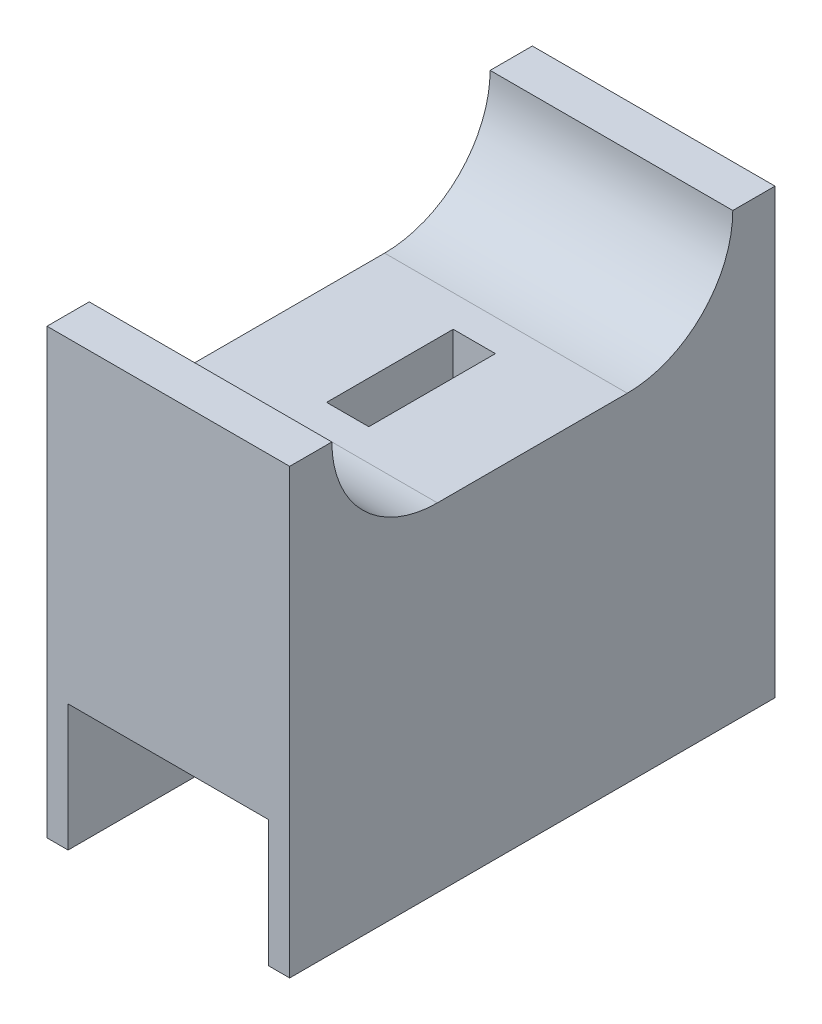
ISO-10303-21;
HEADER;
FILE_DESCRIPTION(('STEP AP214'),'2;1');
FILE_NAME('part.step','',(''),(''),'','','');
FILE_SCHEMA(('AUTOMOTIVE_DESIGN { 1 0 10303 214 1 1 1 1 }'));
ENDSEC;
DATA;
#1=APPLICATION_CONTEXT('core data for automotive mechanical design processes');
#2=APPLICATION_PROTOCOL_DEFINITION('international standard','automotive_design',2000,#1);
#3=PRODUCT_CONTEXT('',#1,'mechanical');
#4=PRODUCT('Part','Part','',(#3));
#5=PRODUCT_RELATED_PRODUCT_CATEGORY('part','',(#4));
#6=PRODUCT_DEFINITION_FORMATION('','',#4);
#7=PRODUCT_DEFINITION_CONTEXT('part definition',#1,'design');
#8=PRODUCT_DEFINITION('design','',#6,#7);
#9=PRODUCT_DEFINITION_SHAPE('','',#8);
#10=(LENGTH_UNIT() NAMED_UNIT(*) SI_UNIT(.MILLI.,.METRE.));
#11=(NAMED_UNIT(*) PLANE_ANGLE_UNIT() SI_UNIT($,.RADIAN.));
#12=(NAMED_UNIT(*) SI_UNIT($,.STERADIAN.) SOLID_ANGLE_UNIT());
#13=UNCERTAINTY_MEASURE_WITH_UNIT(LENGTH_MEASURE(1.E-05),#10,'distance_accuracy_value','');
#14=(GEOMETRIC_REPRESENTATION_CONTEXT(3) GLOBAL_UNCERTAINTY_ASSIGNED_CONTEXT((#13)) GLOBAL_UNIT_ASSIGNED_CONTEXT((#10,
#11,#12)) REPRESENTATION_CONTEXT('',''));
#15=CARTESIAN_POINT('',(0.,0.,0.));
#16=DIRECTION('',(0.,0.,1.));
#17=DIRECTION('',(1.,0.,0.));
#18=AXIS2_PLACEMENT_3D('',#15,#16,#17);
#19=CARTESIAN_POINT('',(0.,15.,0.));
#20=DIRECTION('',(0.,-1.,0.));
#21=DIRECTION('',(0.,0.,-1.));
#22=AXIS2_PLACEMENT_3D('',#19,#20,#21);
#23=PLANE('',#22);
#24=DIRECTION('',(0.,0.,1.));
#25=VECTOR('',#24,1.);
#26=CARTESIAN_POINT('',(-5.75000000000006,15.,11.5000000000001));
#27=LINE('',#26,#25);
#28=CARTESIAN_POINT('',(-5.75000000000006,15.,-11.5000000000001));
#29=VERTEX_POINT('',#28);
#30=CARTESIAN_POINT('',(-5.74999999999994,15.,-9.50000000000007));
#31=VERTEX_POINT('',#30);
#32=EDGE_CURVE('E192',#29,#31,#27,.T.);
#33=ORIENTED_EDGE('',*,*,#32,.T.);
#34=DIRECTION('',(-1.,0.,0.));
#35=VECTOR('',#34,1.);
#36=CARTESIAN_POINT('',(5.75000000000006,15.,-9.50000000000007));
#37=LINE('',#36,#35);
#38=CARTESIAN_POINT('',(5.75000000000006,15.,-9.50000000000007));
#39=VERTEX_POINT('',#38);
#40=EDGE_CURVE('E178',#39,#31,#37,.T.);
#41=ORIENTED_EDGE('',*,*,#40,.F.);
#42=DIRECTION('',(0.,0.,-1.));
#43=VECTOR('',#42,1.);
#44=CARTESIAN_POINT('',(5.75000000000006,15.,11.5000000000001));
#45=LINE('',#44,#43);
#46=CARTESIAN_POINT('',(5.75000000000006,15.,-11.5000000000001));
#47=VERTEX_POINT('',#46);
#48=EDGE_CURVE('E175',#39,#47,#45,.T.);
#49=ORIENTED_EDGE('',*,*,#48,.T.);
#50=DIRECTION('',(-1.,0.,0.));
#51=VECTOR('',#50,1.);
#52=CARTESIAN_POINT('',(-5.75000000000006,15.,-11.5000000000001));
#53=LINE('',#52,#51);
#54=EDGE_CURVE('E174',#47,#29,#53,.T.);
#55=ORIENTED_EDGE('',*,*,#54,.T.);
#56=EDGE_LOOP('',(#33,#41,#49,#55));
#57=FACE_BOUND('',#56,.T.);
#58=ADVANCED_FACE('F45',(#57),#23,.F.);
#59=CARTESIAN_POINT('',(0.,-6.,0.));
#60=DIRECTION('',(0.,1.,0.));
#61=DIRECTION('',(0.,0.,1.));
#62=AXIS2_PLACEMENT_3D('',#59,#60,#61);
#63=PLANE('',#62);
#64=DIRECTION('',(1.,0.,0.));
#65=VECTOR('',#64,1.);
#66=CARTESIAN_POINT('',(-5.75000000000006,-6.,-11.5000000000001));
#67=LINE('',#66,#65);
#68=CARTESIAN_POINT('',(-5.75000000000006,-6.,-11.5000000000001));
#69=VERTEX_POINT('',#68);
#70=CARTESIAN_POINT('',(-4.75,-6.,-11.5000000000001));
#71=VERTEX_POINT('',#70);
#72=EDGE_CURVE('E288',#69,#71,#67,.T.);
#73=ORIENTED_EDGE('',*,*,#72,.T.);
#74=DIRECTION('',(0.,0.,1.));
#75=VECTOR('',#74,1.);
#76=CARTESIAN_POINT('',(-4.75,-6.,-11.5000000000001));
#77=LINE('',#76,#75);
#78=CARTESIAN_POINT('',(-4.75,-6.,11.5000000000001));
#79=VERTEX_POINT('',#78);
#80=EDGE_CURVE('E252',#71,#79,#77,.T.);
#81=ORIENTED_EDGE('',*,*,#80,.T.);
#82=DIRECTION('',(-1.,0.,0.));
#83=VECTOR('',#82,1.);
#84=CARTESIAN_POINT('',(-5.75000000000006,-6.,11.5000000000001));
#85=LINE('',#84,#83);
#86=CARTESIAN_POINT('',(-5.75000000000006,-6.,11.5000000000001));
#87=VERTEX_POINT('',#86);
#88=EDGE_CURVE('E278',#79,#87,#85,.T.);
#89=ORIENTED_EDGE('',*,*,#88,.T.);
#90=DIRECTION('',(0.,0.,-1.));
#91=VECTOR('',#90,1.);
#92=CARTESIAN_POINT('',(-5.75000000000006,-6.,-11.5000000000001));
#93=LINE('',#92,#91);
#94=EDGE_CURVE('E283',#87,#69,#93,.T.);
#95=ORIENTED_EDGE('',*,*,#94,.T.);
#96=EDGE_LOOP('',(#73,#81,#89,#95));
#97=FACE_BOUND('',#96,.T.);
#98=ADVANCED_FACE('F337',(#97),#63,.F.);
#99=CARTESIAN_POINT('',(5.75000000000006,11.,11.5000000000001));
#100=DIRECTION('',(-1.,0.,0.));
#101=DIRECTION('',(0.,0.,1.));
#102=AXIS2_PLACEMENT_3D('',#99,#100,#101);
#103=PLANE('',#102);
#104=ORIENTED_EDGE('',*,*,#48,.F.);
#105=CARTESIAN_POINT('',(5.75000000000006,15.,-4.50000000000007));
#106=DIRECTION('',(-1.,0.,0.));
#107=DIRECTION('',(0.,0.,1.));
#108=AXIS2_PLACEMENT_3D('',#105,#106,#107);
#109=CIRCLE('',#108,5.);
#110=CARTESIAN_POINT('',(5.75000000000006,10.,-4.50000000000007));
#111=VERTEX_POINT('',#110);
#112=EDGE_CURVE('E68',#39,#111,#109,.T.);
#113=ORIENTED_EDGE('',*,*,#112,.T.);
#114=DIRECTION('',(0.,0.,1.));
#115=VECTOR('',#114,1.);
#116=CARTESIAN_POINT('',(5.75000000000006,10.,-9.50000000000007));
#117=LINE('',#116,#115);
#118=CARTESIAN_POINT('',(5.75000000000006,10.,4.50000000000006));
#119=VERTEX_POINT('',#118);
#120=EDGE_CURVE('E162',#111,#119,#117,.T.);
#121=ORIENTED_EDGE('',*,*,#120,.T.);
#122=CARTESIAN_POINT('',(5.75000000000006,15.,4.50000000000007));
#123=DIRECTION('',(-1.,0.,0.));
#124=DIRECTION('',(0.,0.,1.));
#125=AXIS2_PLACEMENT_3D('',#122,#123,#124);
#126=CIRCLE('',#125,5.);
#127=CARTESIAN_POINT('',(5.75000000000006,15.,9.50000000000007));
#128=VERTEX_POINT('',#127);
#129=EDGE_CURVE('E11',#119,#128,#126,.T.);
#130=ORIENTED_EDGE('',*,*,#129,.T.);
#131=CARTESIAN_POINT('',(5.75000000000006,15.,11.5000000000001));
#132=VERTEX_POINT('',#131);
#133=EDGE_CURVE('E161',#132,#128,#45,.T.);
#134=ORIENTED_EDGE('',*,*,#133,.F.);
#135=DIRECTION('',(0.,-1.,0.));
#136=VECTOR('',#135,1.);
#137=CARTESIAN_POINT('',(5.75000000000006,11.,11.5000000000001));
#138=LINE('',#137,#136);
#139=CARTESIAN_POINT('',(5.75000000000006,-6.,11.5000000000001));
#140=VERTEX_POINT('',#139);
#141=EDGE_CURVE('E292',#132,#140,#138,.T.);
#142=ORIENTED_EDGE('',*,*,#141,.T.);
#143=DIRECTION('',(0.,0.,1.));
#144=VECTOR('',#143,1.);
#145=CARTESIAN_POINT('',(5.75000000000006,-6.,-11.5000000000001));
#146=LINE('',#145,#144);
#147=CARTESIAN_POINT('',(5.75000000000006,-6.,-11.5000000000001));
#148=VERTEX_POINT('',#147);
#149=EDGE_CURVE('E265',#148,#140,#146,.T.);
#150=ORIENTED_EDGE('',*,*,#149,.F.);
#151=DIRECTION('',(0.,-1.,0.));
#152=VECTOR('',#151,1.);
#153=CARTESIAN_POINT('',(5.75000000000006,11.,-11.5000000000001));
#154=LINE('',#153,#152);
#155=EDGE_CURVE('E302',#47,#148,#154,.T.);
#156=ORIENTED_EDGE('',*,*,#155,.F.);
#157=EDGE_LOOP('',(#104,#113,#121,#130,#134,#142,#150,#156));
#158=FACE_BOUND('',#157,.T.);
#159=ADVANCED_FACE('F160',(#158),#103,.F.);
#160=CARTESIAN_POINT('',(-5.74999999999994,11.,-11.5000000000001));
#161=DIRECTION('',(0.,0.,1.));
#162=DIRECTION('',(1.,0.,0.));
#163=AXIS2_PLACEMENT_3D('',#160,#161,#162);
#164=PLANE('',#163);
#165=DIRECTION('',(-1.,0.,0.));
#166=VECTOR('',#165,1.);
#167=CARTESIAN_POINT('',(-4.75,0.,-11.5000000000001));
#168=LINE('',#167,#166);
#169=CARTESIAN_POINT('',(4.75,0.,-11.5000000000001));
#170=VERTEX_POINT('',#169);
#171=CARTESIAN_POINT('',(-4.75,0.,-11.5000000000001));
#172=VERTEX_POINT('',#171);
#173=EDGE_CURVE('E248',#170,#172,#168,.T.);
#174=ORIENTED_EDGE('',*,*,#173,.T.);
#175=DIRECTION('',(0.,-1.,0.));
#176=VECTOR('',#175,1.);
#177=CARTESIAN_POINT('',(-4.75,-6.,-11.5000000000001));
#178=LINE('',#177,#176);
#179=EDGE_CURVE('E239',#172,#71,#178,.T.);
#180=ORIENTED_EDGE('',*,*,#179,.T.);
#181=ORIENTED_EDGE('',*,*,#72,.F.);
#182=DIRECTION('',(0.,-1.,0.));
#183=VECTOR('',#182,1.);
#184=CARTESIAN_POINT('',(-5.74999999999994,11.,-11.5000000000001));
#185=LINE('',#184,#183);
#186=EDGE_CURVE('E299',#29,#69,#185,.T.);
#187=ORIENTED_EDGE('',*,*,#186,.F.);
#188=ORIENTED_EDGE('',*,*,#54,.F.);
#189=ORIENTED_EDGE('',*,*,#155,.T.);
#190=CARTESIAN_POINT('',(4.75,-6.,-11.5000000000001));
#191=VERTEX_POINT('',#190);
#192=EDGE_CURVE('E287',#191,#148,#67,.T.);
#193=ORIENTED_EDGE('',*,*,#192,.F.);
#194=DIRECTION('',(0.,1.,0.));
#195=VECTOR('',#194,1.);
#196=CARTESIAN_POINT('',(4.75,-6.,-11.5000000000001));
#197=LINE('',#196,#195);
#198=EDGE_CURVE('E243',#191,#170,#197,.T.);
#199=ORIENTED_EDGE('',*,*,#198,.T.);
#200=EDGE_LOOP('',(#174,#180,#181,#187,#188,#189,#193,#199));
#201=FACE_BOUND('',#200,.T.);
#202=ADVANCED_FACE('F331',(#201),#164,.F.);
#203=CARTESIAN_POINT('',(-5.74999999999994,11.,11.5000000000001));
#204=DIRECTION('',(1.,0.,0.));
#205=DIRECTION('',(0.,0.,-1.));
#206=AXIS2_PLACEMENT_3D('',#203,#204,#205);
#207=PLANE('',#206);
#208=DIRECTION('',(0.,0.,1.));
#209=VECTOR('',#208,1.);
#210=CARTESIAN_POINT('',(-5.74999999999994,10.,-9.50000000000007));
#211=LINE('',#210,#209);
#212=CARTESIAN_POINT('',(-5.74999999999994,10.,-4.50000000000007));
#213=VERTEX_POINT('',#212);
#214=CARTESIAN_POINT('',(-5.74999999999994,10.,4.50000000000006));
#215=VERTEX_POINT('',#214);
#216=EDGE_CURVE('E184',#213,#215,#211,.T.);
#217=ORIENTED_EDGE('',*,*,#216,.F.);
#218=CARTESIAN_POINT('',(-5.74999999999994,15.,-4.50000000000007));
#219=DIRECTION('',(1.,0.,0.));
#220=DIRECTION('',(0.,0.,-1.));
#221=AXIS2_PLACEMENT_3D('',#218,#219,#220);
#222=CIRCLE('',#221,5.);
#223=EDGE_CURVE('E312',#213,#31,#222,.T.);
#224=ORIENTED_EDGE('',*,*,#223,.T.);
#225=ORIENTED_EDGE('',*,*,#32,.F.);
#226=ORIENTED_EDGE('',*,*,#186,.T.);
#227=ORIENTED_EDGE('',*,*,#94,.F.);
#228=DIRECTION('',(0.,-1.,0.));
#229=VECTOR('',#228,1.);
#230=CARTESIAN_POINT('',(-5.74999999999994,11.,11.5000000000001));
#231=LINE('',#230,#229);
#232=CARTESIAN_POINT('',(-5.75000000000006,15.,11.5000000000001));
#233=VERTEX_POINT('',#232);
#234=EDGE_CURVE('E295',#233,#87,#231,.T.);
#235=ORIENTED_EDGE('',*,*,#234,.F.);
#236=CARTESIAN_POINT('',(-5.75000000000006,15.,9.50000000000007));
#237=VERTEX_POINT('',#236);
#238=EDGE_CURVE('E191',#237,#233,#27,.T.);
#239=ORIENTED_EDGE('',*,*,#238,.F.);
#240=CARTESIAN_POINT('',(-5.74999999999994,15.,4.50000000000007));
#241=DIRECTION('',(1.,0.,0.));
#242=DIRECTION('',(0.,0.,-1.));
#243=AXIS2_PLACEMENT_3D('',#240,#241,#242);
#244=CIRCLE('',#243,5.);
#245=EDGE_CURVE('E54',#237,#215,#244,.T.);
#246=ORIENTED_EDGE('',*,*,#245,.T.);
#247=EDGE_LOOP('',(#217,#224,#225,#226,#227,#235,#239,#246));
#248=FACE_BOUND('',#247,.T.);
#249=ADVANCED_FACE('F319',(#248),#207,.F.);
#250=CARTESIAN_POINT('',(-5.74999999999994,11.,11.5000000000001));
#251=DIRECTION('',(0.,0.,-1.));
#252=DIRECTION('',(-1.,0.,0.));
#253=AXIS2_PLACEMENT_3D('',#250,#251,#252);
#254=PLANE('',#253);
#255=ORIENTED_EDGE('',*,*,#88,.F.);
#256=DIRECTION('',(0.,-1.,0.));
#257=VECTOR('',#256,1.);
#258=CARTESIAN_POINT('',(-4.75,-6.,11.5000000000001));
#259=LINE('',#258,#257);
#260=CARTESIAN_POINT('',(-4.75,0.,11.5000000000001));
#261=VERTEX_POINT('',#260);
#262=EDGE_CURVE('E229',#261,#79,#259,.T.);
#263=ORIENTED_EDGE('',*,*,#262,.F.);
#264=DIRECTION('',(-1.,0.,0.));
#265=VECTOR('',#264,1.);
#266=CARTESIAN_POINT('',(-4.75,0.,11.5000000000001));
#267=LINE('',#266,#265);
#268=CARTESIAN_POINT('',(4.75,0.,11.5000000000001));
#269=VERTEX_POINT('',#268);
#270=EDGE_CURVE('E244',#269,#261,#267,.T.);
#271=ORIENTED_EDGE('',*,*,#270,.F.);
#272=DIRECTION('',(0.,1.,0.));
#273=VECTOR('',#272,1.);
#274=CARTESIAN_POINT('',(4.75,-6.,11.5000000000001));
#275=LINE('',#274,#273);
#276=CARTESIAN_POINT('',(4.75,-6.,11.5000000000001));
#277=VERTEX_POINT('',#276);
#278=EDGE_CURVE('E255',#277,#269,#275,.T.);
#279=ORIENTED_EDGE('',*,*,#278,.F.);
#280=EDGE_CURVE('E279',#140,#277,#85,.T.);
#281=ORIENTED_EDGE('',*,*,#280,.F.);
#282=ORIENTED_EDGE('',*,*,#141,.F.);
#283=DIRECTION('',(1.,0.,0.));
#284=VECTOR('',#283,1.);
#285=CARTESIAN_POINT('',(-5.75000000000006,15.,11.5000000000001));
#286=LINE('',#285,#284);
#287=EDGE_CURVE('E172',#233,#132,#286,.T.);
#288=ORIENTED_EDGE('',*,*,#287,.F.);
#289=ORIENTED_EDGE('',*,*,#234,.T.);
#290=EDGE_LOOP('',(#255,#263,#271,#279,#281,#282,#288,#289));
#291=FACE_BOUND('',#290,.T.);
#292=ADVANCED_FACE('F342',(#291),#254,.F.);
#293=ORIENTED_EDGE('',*,*,#280,.T.);
#294=DIRECTION('',(0.,0.,1.));
#295=VECTOR('',#294,1.);
#296=CARTESIAN_POINT('',(4.75,-6.,-11.5000000000001));
#297=LINE('',#296,#295);
#298=EDGE_CURVE('E269',#191,#277,#297,.T.);
#299=ORIENTED_EDGE('',*,*,#298,.F.);
#300=ORIENTED_EDGE('',*,*,#192,.T.);
#301=ORIENTED_EDGE('',*,*,#149,.T.);
#302=EDGE_LOOP('',(#293,#299,#300,#301));
#303=FACE_BOUND('',#302,.T.);
#304=ADVANCED_FACE('F346',(#303),#63,.F.);
#305=CARTESIAN_POINT('',(-4.75,-6.,-11.5000000000001));
#306=DIRECTION('',(-1.,0.,0.));
#307=DIRECTION('',(0.,-1.,0.));
#308=AXIS2_PLACEMENT_3D('',#305,#306,#307);
#309=PLANE('',#308);
#310=ORIENTED_EDGE('',*,*,#262,.T.);
#311=ORIENTED_EDGE('',*,*,#80,.F.);
#312=ORIENTED_EDGE('',*,*,#179,.F.);
#313=DIRECTION('',(0.,0.,1.));
#314=VECTOR('',#313,1.);
#315=CARTESIAN_POINT('',(-4.75,0.,-11.5000000000001));
#316=LINE('',#315,#314);
#317=EDGE_CURVE('E262',#172,#261,#316,.T.);
#318=ORIENTED_EDGE('',*,*,#317,.T.);
#319=EDGE_LOOP('',(#310,#311,#312,#318));
#320=FACE_BOUND('',#319,.T.);
#321=ADVANCED_FACE('F359',(#320),#309,.F.);
#322=CARTESIAN_POINT('',(-4.75,0.,-11.5000000000001));
#323=DIRECTION('',(0.,1.,0.));
#324=DIRECTION('',(0.,0.,1.));
#325=AXIS2_PLACEMENT_3D('',#322,#323,#324);
#326=PLANE('',#325);
#327=DIRECTION('',(-1.,0.,0.));
#328=VECTOR('',#327,1.);
#329=CARTESIAN_POINT('',(-1.,0.,3.));
#330=LINE('',#329,#328);
#331=CARTESIAN_POINT('',(1.,0.,3.));
#332=VERTEX_POINT('',#331);
#333=CARTESIAN_POINT('',(-1.,0.,3.));
#334=VERTEX_POINT('',#333);
#335=EDGE_CURVE('E215',#332,#334,#330,.T.);
#336=ORIENTED_EDGE('',*,*,#335,.F.);
#337=DIRECTION('',(0.,0.,1.));
#338=VECTOR('',#337,1.);
#339=CARTESIAN_POINT('',(1.,0.,-3.));
#340=LINE('',#339,#338);
#341=CARTESIAN_POINT('',(1.,0.,-3.));
#342=VERTEX_POINT('',#341);
#343=EDGE_CURVE('E198',#342,#332,#340,.T.);
#344=ORIENTED_EDGE('',*,*,#343,.F.);
#345=DIRECTION('',(1.,0.,0.));
#346=VECTOR('',#345,1.);
#347=CARTESIAN_POINT('',(-1.,0.,-3.));
#348=LINE('',#347,#346);
#349=CARTESIAN_POINT('',(-1.,0.,-3.));
#350=VERTEX_POINT('',#349);
#351=EDGE_CURVE('E203',#350,#342,#348,.T.);
#352=ORIENTED_EDGE('',*,*,#351,.F.);
#353=DIRECTION('',(0.,0.,-1.));
#354=VECTOR('',#353,1.);
#355=CARTESIAN_POINT('',(-1.,0.,-3.));
#356=LINE('',#355,#354);
#357=EDGE_CURVE('E219',#334,#350,#356,.T.);
#358=ORIENTED_EDGE('',*,*,#357,.F.);
#359=EDGE_LOOP('',(#336,#344,#352,#358));
#360=FACE_BOUND('',#359,.T.);
#361=ORIENTED_EDGE('',*,*,#270,.T.);
#362=ORIENTED_EDGE('',*,*,#317,.F.);
#363=ORIENTED_EDGE('',*,*,#173,.F.);
#364=DIRECTION('',(0.,0.,1.));
#365=VECTOR('',#364,1.);
#366=CARTESIAN_POINT('',(4.75,0.,-11.5000000000001));
#367=LINE('',#366,#365);
#368=EDGE_CURVE('E266',#170,#269,#367,.T.);
#369=ORIENTED_EDGE('',*,*,#368,.T.);
#370=EDGE_LOOP('',(#361,#362,#363,#369));
#371=FACE_BOUND('',#370,.T.);
#372=ADVANCED_FACE('F356',(#360,#371),#326,.F.);
#373=CARTESIAN_POINT('',(4.75,-6.,-11.5000000000001));
#374=DIRECTION('',(1.,0.,0.));
#375=DIRECTION('',(0.,0.,-1.));
#376=AXIS2_PLACEMENT_3D('',#373,#374,#375);
#377=PLANE('',#376);
#378=ORIENTED_EDGE('',*,*,#278,.T.);
#379=ORIENTED_EDGE('',*,*,#368,.F.);
#380=ORIENTED_EDGE('',*,*,#198,.F.);
#381=ORIENTED_EDGE('',*,*,#298,.T.);
#382=EDGE_LOOP('',(#378,#379,#380,#381));
#383=FACE_BOUND('',#382,.T.);
#384=ADVANCED_FACE('F353',(#383),#377,.F.);
#385=CARTESIAN_POINT('',(1.,10.,-3.));
#386=DIRECTION('',(1.,0.,0.));
#387=DIRECTION('',(0.,0.,-1.));
#388=AXIS2_PLACEMENT_3D('',#385,#386,#387);
#389=PLANE('',#388);
#390=ORIENTED_EDGE('',*,*,#343,.T.);
#391=DIRECTION('',(0.,-1.,0.));
#392=VECTOR('',#391,1.);
#393=CARTESIAN_POINT('',(1.,10.,3.));
#394=LINE('',#393,#392);
#395=CARTESIAN_POINT('',(1.,10.,3.));
#396=VERTEX_POINT('',#395);
#397=EDGE_CURVE('E212',#396,#332,#394,.T.);
#398=ORIENTED_EDGE('',*,*,#397,.F.);
#399=DIRECTION('',(0.,0.,1.));
#400=VECTOR('',#399,1.);
#401=CARTESIAN_POINT('',(1.,10.,-3.));
#402=LINE('',#401,#400);
#403=CARTESIAN_POINT('',(1.,10.,-3.));
#404=VERTEX_POINT('',#403);
#405=EDGE_CURVE('E199',#404,#396,#402,.T.);
#406=ORIENTED_EDGE('',*,*,#405,.F.);
#407=DIRECTION('',(0.,-1.,0.));
#408=VECTOR('',#407,1.);
#409=CARTESIAN_POINT('',(1.,10.,-3.));
#410=LINE('',#409,#408);
#411=EDGE_CURVE('E226',#404,#342,#410,.T.);
#412=ORIENTED_EDGE('',*,*,#411,.T.);
#413=EDGE_LOOP('',(#390,#398,#406,#412));
#414=FACE_BOUND('',#413,.T.);
#415=ADVANCED_FACE('F397',(#414),#389,.F.);
#416=CARTESIAN_POINT('',(-1.,10.,-3.));
#417=DIRECTION('',(0.,0.,-1.));
#418=DIRECTION('',(-1.,0.,0.));
#419=AXIS2_PLACEMENT_3D('',#416,#417,#418);
#420=PLANE('',#419);
#421=ORIENTED_EDGE('',*,*,#351,.T.);
#422=ORIENTED_EDGE('',*,*,#411,.F.);
#423=DIRECTION('',(1.,0.,0.));
#424=VECTOR('',#423,1.);
#425=CARTESIAN_POINT('',(-1.,10.,-3.));
#426=LINE('',#425,#424);
#427=CARTESIAN_POINT('',(-1.,10.,-3.));
#428=VERTEX_POINT('',#427);
#429=EDGE_CURVE('E209',#428,#404,#426,.T.);
#430=ORIENTED_EDGE('',*,*,#429,.F.);
#431=DIRECTION('',(0.,-1.,0.));
#432=VECTOR('',#431,1.);
#433=CARTESIAN_POINT('',(-1.,10.,-3.));
#434=LINE('',#433,#432);
#435=EDGE_CURVE('E230',#428,#350,#434,.T.);
#436=ORIENTED_EDGE('',*,*,#435,.T.);
#437=EDGE_LOOP('',(#421,#422,#430,#436));
#438=FACE_BOUND('',#437,.T.);
#439=ADVANCED_FACE('F393',(#438),#420,.F.);
#440=CARTESIAN_POINT('',(-1.,10.,-3.));
#441=DIRECTION('',(-1.,0.,0.));
#442=DIRECTION('',(0.,0.,1.));
#443=AXIS2_PLACEMENT_3D('',#440,#441,#442);
#444=PLANE('',#443);
#445=ORIENTED_EDGE('',*,*,#357,.T.);
#446=ORIENTED_EDGE('',*,*,#435,.F.);
#447=DIRECTION('',(0.,0.,-1.));
#448=VECTOR('',#447,1.);
#449=CARTESIAN_POINT('',(-1.,10.,-3.));
#450=LINE('',#449,#448);
#451=CARTESIAN_POINT('',(-1.,10.,3.));
#452=VERTEX_POINT('',#451);
#453=EDGE_CURVE('E206',#452,#428,#450,.T.);
#454=ORIENTED_EDGE('',*,*,#453,.F.);
#455=DIRECTION('',(0.,-1.,0.));
#456=VECTOR('',#455,1.);
#457=CARTESIAN_POINT('',(-1.,10.,3.));
#458=LINE('',#457,#456);
#459=EDGE_CURVE('E233',#452,#334,#458,.T.);
#460=ORIENTED_EDGE('',*,*,#459,.T.);
#461=EDGE_LOOP('',(#445,#446,#454,#460));
#462=FACE_BOUND('',#461,.T.);
#463=ADVANCED_FACE('F387',(#462),#444,.F.);
#464=CARTESIAN_POINT('',(-1.,10.,3.));
#465=DIRECTION('',(0.,0.,1.));
#466=DIRECTION('',(1.,0.,0.));
#467=AXIS2_PLACEMENT_3D('',#464,#465,#466);
#468=PLANE('',#467);
#469=ORIENTED_EDGE('',*,*,#335,.T.);
#470=ORIENTED_EDGE('',*,*,#459,.F.);
#471=DIRECTION('',(-1.,0.,0.));
#472=VECTOR('',#471,1.);
#473=CARTESIAN_POINT('',(-1.,10.,3.));
#474=LINE('',#473,#472);
#475=EDGE_CURVE('E202',#396,#452,#474,.T.);
#476=ORIENTED_EDGE('',*,*,#475,.F.);
#477=ORIENTED_EDGE('',*,*,#397,.T.);
#478=EDGE_LOOP('',(#469,#470,#476,#477));
#479=FACE_BOUND('',#478,.T.);
#480=ADVANCED_FACE('F381',(#479),#468,.F.);
#481=ORIENTED_EDGE('',*,*,#133,.T.);
#482=DIRECTION('',(-1.,0.,0.));
#483=VECTOR('',#482,1.);
#484=CARTESIAN_POINT('',(5.75000000000006,15.,9.50000000000007));
#485=LINE('',#484,#483);
#486=EDGE_CURVE('E169',#128,#237,#485,.T.);
#487=ORIENTED_EDGE('',*,*,#486,.T.);
#488=ORIENTED_EDGE('',*,*,#238,.T.);
#489=ORIENTED_EDGE('',*,*,#287,.T.);
#490=EDGE_LOOP('',(#481,#487,#488,#489));
#491=FACE_BOUND('',#490,.T.);
#492=ADVANCED_FACE('F168',(#491),#23,.F.);
#493=CARTESIAN_POINT('',(5.75000000000006,10.,-9.50000000000007));
#494=DIRECTION('',(0.,-1.,0.));
#495=DIRECTION('',(0.,0.,-1.));
#496=AXIS2_PLACEMENT_3D('',#493,#494,#495);
#497=PLANE('',#496);
#498=ORIENTED_EDGE('',*,*,#405,.T.);
#499=ORIENTED_EDGE('',*,*,#475,.T.);
#500=ORIENTED_EDGE('',*,*,#453,.T.);
#501=ORIENTED_EDGE('',*,*,#429,.T.);
#502=EDGE_LOOP('',(#498,#499,#500,#501));
#503=FACE_BOUND('',#502,.T.);
#504=ORIENTED_EDGE('',*,*,#120,.F.);
#505=DIRECTION('',(-1.,0.,0.));
#506=VECTOR('',#505,1.);
#507=CARTESIAN_POINT('',(-5.74999999999994,10.,-4.50000000000007));
#508=LINE('',#507,#506);
#509=EDGE_CURVE('E308',#111,#213,#508,.T.);
#510=ORIENTED_EDGE('',*,*,#509,.T.);
#511=ORIENTED_EDGE('',*,*,#216,.T.);
#512=DIRECTION('',(-1.,0.,0.));
#513=VECTOR('',#512,1.);
#514=CARTESIAN_POINT('',(5.75000000000006,10.,4.50000000000007));
#515=LINE('',#514,#513);
#516=EDGE_CURVE('E61',#215,#119,#515,.F.);
#517=ORIENTED_EDGE('',*,*,#516,.T.);
#518=EDGE_LOOP('',(#504,#510,#511,#517));
#519=FACE_BOUND('',#518,.T.);
#520=ADVANCED_FACE('F321',(#503,#519),#497,.F.);
#521=CARTESIAN_POINT('',(5.75000000000006,15.,-4.50000000000007));
#522=DIRECTION('',(1.,0.,0.));
#523=DIRECTION('',(0.,0.,-1.));
#524=AXIS2_PLACEMENT_3D('',#521,#522,#523);
#525=CYLINDRICAL_SURFACE('',#524,5.);
#526=ORIENTED_EDGE('',*,*,#112,.F.);
#527=ORIENTED_EDGE('',*,*,#40,.T.);
#528=ORIENTED_EDGE('',*,*,#223,.F.);
#529=ORIENTED_EDGE('',*,*,#509,.F.);
#530=EDGE_LOOP('',(#526,#527,#528,#529));
#531=FACE_BOUND('',#530,.T.);
#532=ADVANCED_FACE('F325',(#531),#525,.F.);
#533=CARTESIAN_POINT('',(5.75000000000006,15.,4.50000000000007));
#534=DIRECTION('',(1.,0.,0.));
#535=DIRECTION('',(0.,0.,-1.));
#536=AXIS2_PLACEMENT_3D('',#533,#534,#535);
#537=CYLINDRICAL_SURFACE('',#536,5.);
#538=ORIENTED_EDGE('',*,*,#129,.F.);
#539=ORIENTED_EDGE('',*,*,#516,.F.);
#540=ORIENTED_EDGE('',*,*,#245,.F.);
#541=ORIENTED_EDGE('',*,*,#486,.F.);
#542=EDGE_LOOP('',(#538,#539,#540,#541));
#543=FACE_BOUND('',#542,.T.);
#544=ADVANCED_FACE('F47',(#543),#537,.F.);
#545=CLOSED_SHELL('',(#58,#98,#159,#202,#249,#292,#304,#321,#372,#384,#415,#439,#463,#480,#492,
#520,#532,#544));
#546=MANIFOLD_SOLID_BREP('B2',#545);
#547=ADVANCED_BREP_SHAPE_REPRESENTATION('',(#18,#546),#14);
#548=SHAPE_DEFINITION_REPRESENTATION(#9,#547);
ENDSEC;
END-ISO-10303-21;
